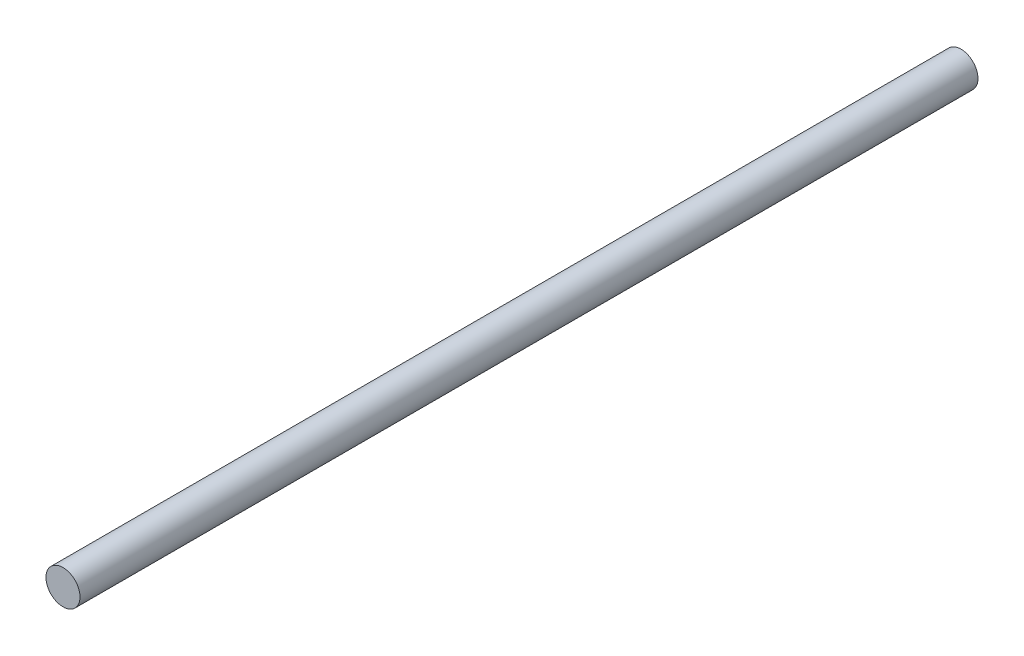
ISO-10303-21;
HEADER;
FILE_DESCRIPTION(('STEP AP214'),'2;1');
FILE_NAME('part.step','',(''),(''),'','','');
FILE_SCHEMA(('AUTOMOTIVE_DESIGN { 1 0 10303 214 1 1 1 1 }'));
ENDSEC;
DATA;
#1=APPLICATION_CONTEXT('core data for automotive mechanical design processes');
#2=APPLICATION_PROTOCOL_DEFINITION('international standard','automotive_design',2000,#1);
#3=PRODUCT_CONTEXT('',#1,'mechanical');
#4=PRODUCT('Part','Part','',(#3));
#5=PRODUCT_RELATED_PRODUCT_CATEGORY('part','',(#4));
#6=PRODUCT_DEFINITION_FORMATION('','',#4);
#7=PRODUCT_DEFINITION_CONTEXT('part definition',#1,'design');
#8=PRODUCT_DEFINITION('design','',#6,#7);
#9=PRODUCT_DEFINITION_SHAPE('','',#8);
#10=(LENGTH_UNIT() NAMED_UNIT(*) SI_UNIT(.MILLI.,.METRE.));
#11=(NAMED_UNIT(*) PLANE_ANGLE_UNIT() SI_UNIT($,.RADIAN.));
#12=(NAMED_UNIT(*) SI_UNIT($,.STERADIAN.) SOLID_ANGLE_UNIT());
#13=UNCERTAINTY_MEASURE_WITH_UNIT(LENGTH_MEASURE(1.E-05),#10,'distance_accuracy_value','');
#14=(GEOMETRIC_REPRESENTATION_CONTEXT(3) GLOBAL_UNCERTAINTY_ASSIGNED_CONTEXT((#13)) GLOBAL_UNIT_ASSIGNED_CONTEXT((#10,
#11,#12)) REPRESENTATION_CONTEXT('',''));
#15=CARTESIAN_POINT('',(0.,0.,0.));
#16=DIRECTION('',(0.,0.,1.));
#17=DIRECTION('',(1.,0.,0.));
#18=AXIS2_PLACEMENT_3D('',#15,#16,#17);
#19=CARTESIAN_POINT('',(0.,0.,580.));
#20=DIRECTION('',(0.,0.,-1.));
#21=DIRECTION('',(-1.,0.,0.));
#22=AXIS2_PLACEMENT_3D('',#19,#20,#21);
#23=CYLINDRICAL_SURFACE('',#22,11.);
#24=CARTESIAN_POINT('',(0.,0.,580.));
#25=DIRECTION('',(0.,0.,1.));
#26=DIRECTION('',(1.,0.,0.));
#27=AXIS2_PLACEMENT_3D('',#24,#25,#26);
#28=CIRCLE('',#27,11.);
#29=CARTESIAN_POINT('',(11.,0.,580.));
#30=VERTEX_POINT('',#29);
#31=EDGE_CURVE('E10',#30,#30,#28,.T.);
#32=ORIENTED_EDGE('',*,*,#31,.F.);
#33=EDGE_LOOP('',(#32));
#34=FACE_BOUND('',#33,.T.);
#35=CARTESIAN_POINT('',(0.,0.,0.));
#36=DIRECTION('',(0.,0.,1.));
#37=DIRECTION('',(1.,0.,0.));
#38=AXIS2_PLACEMENT_3D('',#35,#36,#37);
#39=CIRCLE('',#38,11.);
#40=CARTESIAN_POINT('',(11.,0.,0.));
#41=VERTEX_POINT('',#40);
#42=EDGE_CURVE('E37',#41,#41,#39,.T.);
#43=ORIENTED_EDGE('',*,*,#42,.T.);
#44=EDGE_LOOP('',(#43));
#45=FACE_BOUND('',#44,.T.);
#46=ADVANCED_FACE('F40',(#34,#45),#23,.T.);
#47=CARTESIAN_POINT('',(0.,0.,580.));
#48=DIRECTION('',(0.,0.,1.));
#49=DIRECTION('',(1.,0.,0.));
#50=AXIS2_PLACEMENT_3D('',#47,#48,#49);
#51=PLANE('',#50);
#52=ORIENTED_EDGE('',*,*,#31,.T.);
#53=EDGE_LOOP('',(#52));
#54=FACE_BOUND('',#53,.T.);
#55=ADVANCED_FACE('F55',(#54),#51,.T.);
#56=CARTESIAN_POINT('',(0.,0.,0.));
#57=DIRECTION('',(0.,0.,1.));
#58=DIRECTION('',(1.,0.,0.));
#59=AXIS2_PLACEMENT_3D('',#56,#57,#58);
#60=PLANE('',#59);
#61=ORIENTED_EDGE('',*,*,#42,.F.);
#62=EDGE_LOOP('',(#61));
#63=FACE_BOUND('',#62,.T.);
#64=ADVANCED_FACE('F49',(#63),#60,.F.);
#65=CLOSED_SHELL('',(#46,#55,#64));
#66=MANIFOLD_SOLID_BREP('B2',#65);
#67=ADVANCED_BREP_SHAPE_REPRESENTATION('',(#18,#66),#14);
#68=SHAPE_DEFINITION_REPRESENTATION(#9,#67);
ENDSEC;
END-ISO-10303-21;
